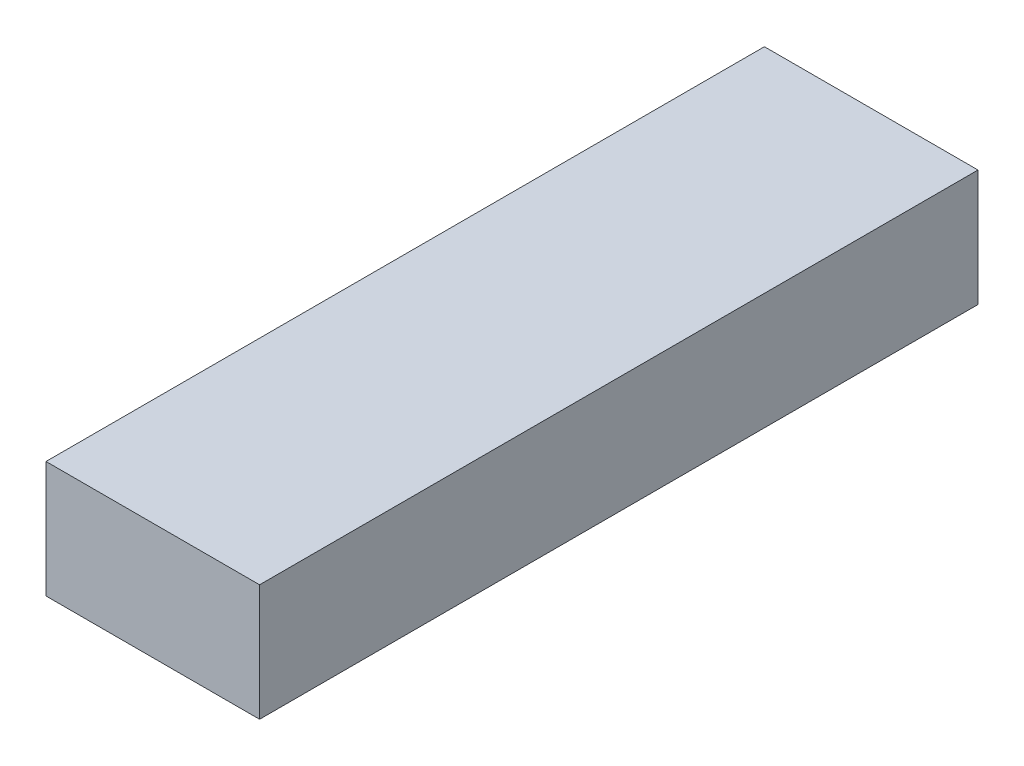
ISO-10303-21;
HEADER;
FILE_DESCRIPTION(('STEP AP214'),'2;1');
FILE_NAME('part.step','',(''),(''),'','','');
FILE_SCHEMA(('AUTOMOTIVE_DESIGN { 1 0 10303 214 1 1 1 1 }'));
ENDSEC;
DATA;
#1=APPLICATION_CONTEXT('core data for automotive mechanical design processes');
#2=APPLICATION_PROTOCOL_DEFINITION('international standard','automotive_design',2000,#1);
#3=PRODUCT_CONTEXT('',#1,'mechanical');
#4=PRODUCT('Part','Part','',(#3));
#5=PRODUCT_RELATED_PRODUCT_CATEGORY('part','',(#4));
#6=PRODUCT_DEFINITION_FORMATION('','',#4);
#7=PRODUCT_DEFINITION_CONTEXT('part definition',#1,'design');
#8=PRODUCT_DEFINITION('design','',#6,#7);
#9=PRODUCT_DEFINITION_SHAPE('','',#8);
#10=(LENGTH_UNIT() NAMED_UNIT(*) SI_UNIT(.MILLI.,.METRE.));
#11=(NAMED_UNIT(*) PLANE_ANGLE_UNIT() SI_UNIT($,.RADIAN.));
#12=(NAMED_UNIT(*) SI_UNIT($,.STERADIAN.) SOLID_ANGLE_UNIT());
#13=UNCERTAINTY_MEASURE_WITH_UNIT(LENGTH_MEASURE(1.E-05),#10,'distance_accuracy_value','');
#14=(GEOMETRIC_REPRESENTATION_CONTEXT(3) GLOBAL_UNCERTAINTY_ASSIGNED_CONTEXT((#13)) GLOBAL_UNIT_ASSIGNED_CONTEXT((#10,
#11,#12)) REPRESENTATION_CONTEXT('',''));
#15=CARTESIAN_POINT('',(0.,0.,0.));
#16=DIRECTION('',(0.,0.,1.));
#17=DIRECTION('',(1.,0.,0.));
#18=AXIS2_PLACEMENT_3D('',#15,#16,#17);
#19=CARTESIAN_POINT('',(-84.3920084067252,38.1,-129.2225));
#20=DIRECTION('',(1.,0.,0.));
#21=DIRECTION('',(0.,0.,-1.));
#22=AXIS2_PLACEMENT_3D('',#19,#20,#21);
#23=PLANE('',#22);
#24=DIRECTION('',(0.,0.,1.));
#25=VECTOR('',#24,1.);
#26=CARTESIAN_POINT('',(-84.3920084067252,0.,-129.2225));
#27=LINE('',#26,#25);
#28=CARTESIAN_POINT('',(-84.3920084067252,0.,-129.2225));
#29=VERTEX_POINT('',#28);
#30=CARTESIAN_POINT('',(-84.3920084067252,0.,105.7275));
#31=VERTEX_POINT('',#30);
#32=EDGE_CURVE('E96',#29,#31,#27,.T.);
#33=ORIENTED_EDGE('',*,*,#32,.T.);
#34=DIRECTION('',(0.,-1.,0.));
#35=VECTOR('',#34,1.);
#36=CARTESIAN_POINT('',(-84.3920084067252,38.1,105.7275));
#37=LINE('',#36,#35);
#38=CARTESIAN_POINT('',(-84.3920084067252,38.1,105.7275));
#39=VERTEX_POINT('',#38);
#40=EDGE_CURVE('E11',#39,#31,#37,.T.);
#41=ORIENTED_EDGE('',*,*,#40,.F.);
#42=DIRECTION('',(0.,0.,1.));
#43=VECTOR('',#42,1.);
#44=CARTESIAN_POINT('',(-84.3920084067252,38.1,-129.2225));
#45=LINE('',#44,#43);
#46=CARTESIAN_POINT('',(-84.3920084067252,38.1,-129.2225));
#47=VERTEX_POINT('',#46);
#48=EDGE_CURVE('E84',#47,#39,#45,.T.);
#49=ORIENTED_EDGE('',*,*,#48,.F.);
#50=DIRECTION('',(0.,-1.,0.));
#51=VECTOR('',#50,1.);
#52=CARTESIAN_POINT('',(-84.3920084067252,38.1,-129.2225));
#53=LINE('',#52,#51);
#54=EDGE_CURVE('E92',#47,#29,#53,.T.);
#55=ORIENTED_EDGE('',*,*,#54,.T.);
#56=EDGE_LOOP('',(#33,#41,#49,#55));
#57=FACE_BOUND('',#56,.T.);
#58=ADVANCED_FACE('F33',(#57),#23,.F.);
#59=CARTESIAN_POINT('',(-84.3920084067252,38.1,105.7275));
#60=DIRECTION('',(0.,0.,-1.));
#61=DIRECTION('',(-1.,0.,0.));
#62=AXIS2_PLACEMENT_3D('',#59,#60,#61);
#63=PLANE('',#62);
#64=DIRECTION('',(1.,0.,0.));
#65=VECTOR('',#64,1.);
#66=CARTESIAN_POINT('',(-84.3920084067252,0.,105.7275));
#67=LINE('',#66,#65);
#68=CARTESIAN_POINT('',(-14.5420084067252,0.,105.7275));
#69=VERTEX_POINT('',#68);
#70=EDGE_CURVE('E88',#31,#69,#67,.T.);
#71=ORIENTED_EDGE('',*,*,#70,.T.);
#72=DIRECTION('',(0.,-1.,0.));
#73=VECTOR('',#72,1.);
#74=CARTESIAN_POINT('',(-14.5420084067252,38.1,105.7275));
#75=LINE('',#74,#73);
#76=CARTESIAN_POINT('',(-14.5420084067252,38.1,105.7275));
#77=VERTEX_POINT('',#76);
#78=EDGE_CURVE('E41',#77,#69,#75,.T.);
#79=ORIENTED_EDGE('',*,*,#78,.F.);
#80=DIRECTION('',(1.,0.,0.));
#81=VECTOR('',#80,1.);
#82=CARTESIAN_POINT('',(-84.3920084067252,38.1,105.7275));
#83=LINE('',#82,#81);
#84=EDGE_CURVE('E79',#39,#77,#83,.T.);
#85=ORIENTED_EDGE('',*,*,#84,.F.);
#86=ORIENTED_EDGE('',*,*,#40,.T.);
#87=EDGE_LOOP('',(#71,#79,#85,#86));
#88=FACE_BOUND('',#87,.T.);
#89=ADVANCED_FACE('F87',(#88),#63,.F.);
#90=CARTESIAN_POINT('',(-14.5420084067252,38.1,-129.2225));
#91=DIRECTION('',(-1.,0.,0.));
#92=DIRECTION('',(0.,0.,1.));
#93=AXIS2_PLACEMENT_3D('',#90,#91,#92);
#94=PLANE('',#93);
#95=DIRECTION('',(0.,0.,-1.));
#96=VECTOR('',#95,1.);
#97=CARTESIAN_POINT('',(-14.5420084067252,0.,-129.2225));
#98=LINE('',#97,#96);
#99=CARTESIAN_POINT('',(-14.5420084067252,0.,-129.2225));
#100=VERTEX_POINT('',#99);
#101=EDGE_CURVE('E66',#69,#100,#98,.T.);
#102=ORIENTED_EDGE('',*,*,#101,.T.);
#103=DIRECTION('',(0.,-1.,0.));
#104=VECTOR('',#103,1.);
#105=CARTESIAN_POINT('',(-14.5420084067252,38.1,-129.2225));
#106=LINE('',#105,#104);
#107=CARTESIAN_POINT('',(-14.5420084067252,38.1,-129.2225));
#108=VERTEX_POINT('',#107);
#109=EDGE_CURVE('E89',#108,#100,#106,.T.);
#110=ORIENTED_EDGE('',*,*,#109,.F.);
#111=DIRECTION('',(0.,0.,-1.));
#112=VECTOR('',#111,1.);
#113=CARTESIAN_POINT('',(-14.5420084067252,38.1,-129.2225));
#114=LINE('',#113,#112);
#115=EDGE_CURVE('E82',#77,#108,#114,.T.);
#116=ORIENTED_EDGE('',*,*,#115,.F.);
#117=ORIENTED_EDGE('',*,*,#78,.T.);
#118=EDGE_LOOP('',(#102,#110,#116,#117));
#119=FACE_BOUND('',#118,.T.);
#120=ADVANCED_FACE('F90',(#119),#94,.F.);
#121=CARTESIAN_POINT('',(-84.3920084067252,38.1,-129.2225));
#122=DIRECTION('',(0.,0.,1.));
#123=DIRECTION('',(1.,0.,0.));
#124=AXIS2_PLACEMENT_3D('',#121,#122,#123);
#125=PLANE('',#124);
#126=DIRECTION('',(-1.,0.,0.));
#127=VECTOR('',#126,1.);
#128=CARTESIAN_POINT('',(-84.3920084067252,0.,-129.2225));
#129=LINE('',#128,#127);
#130=EDGE_CURVE('E72',#100,#29,#129,.T.);
#131=ORIENTED_EDGE('',*,*,#130,.T.);
#132=ORIENTED_EDGE('',*,*,#54,.F.);
#133=DIRECTION('',(-1.,0.,0.));
#134=VECTOR('',#133,1.);
#135=CARTESIAN_POINT('',(-84.3920084067252,38.1,-129.2225));
#136=LINE('',#135,#134);
#137=EDGE_CURVE('E49',#108,#47,#136,.T.);
#138=ORIENTED_EDGE('',*,*,#137,.F.);
#139=ORIENTED_EDGE('',*,*,#109,.T.);
#140=EDGE_LOOP('',(#131,#132,#138,#139));
#141=FACE_BOUND('',#140,.T.);
#142=ADVANCED_FACE('F103',(#141),#125,.F.);
#143=CARTESIAN_POINT('',(0.,38.1,0.));
#144=DIRECTION('',(0.,1.,0.));
#145=DIRECTION('',(0.,0.,1.));
#146=AXIS2_PLACEMENT_3D('',#143,#144,#145);
#147=PLANE('',#146);
#148=ORIENTED_EDGE('',*,*,#48,.T.);
#149=ORIENTED_EDGE('',*,*,#84,.T.);
#150=ORIENTED_EDGE('',*,*,#115,.T.);
#151=ORIENTED_EDGE('',*,*,#137,.T.);
#152=EDGE_LOOP('',(#148,#149,#150,#151));
#153=FACE_BOUND('',#152,.T.);
#154=ADVANCED_FACE('F80',(#153),#147,.T.);
#155=CARTESIAN_POINT('',(0.,0.,0.));
#156=DIRECTION('',(0.,1.,0.));
#157=DIRECTION('',(0.,0.,1.));
#158=AXIS2_PLACEMENT_3D('',#155,#156,#157);
#159=PLANE('',#158);
#160=ORIENTED_EDGE('',*,*,#32,.F.);
#161=ORIENTED_EDGE('',*,*,#130,.F.);
#162=ORIENTED_EDGE('',*,*,#101,.F.);
#163=ORIENTED_EDGE('',*,*,#70,.F.);
#164=EDGE_LOOP('',(#160,#161,#162,#163));
#165=FACE_BOUND('',#164,.T.);
#166=ADVANCED_FACE('F106',(#165),#159,.F.);
#167=CLOSED_SHELL('',(#58,#89,#120,#142,#154,#166));
#168=MANIFOLD_SOLID_BREP('B2',#167);
#169=ADVANCED_BREP_SHAPE_REPRESENTATION('',(#18,#168),#14);
#170=SHAPE_DEFINITION_REPRESENTATION(#9,#169);
ENDSEC;
END-ISO-10303-21;
